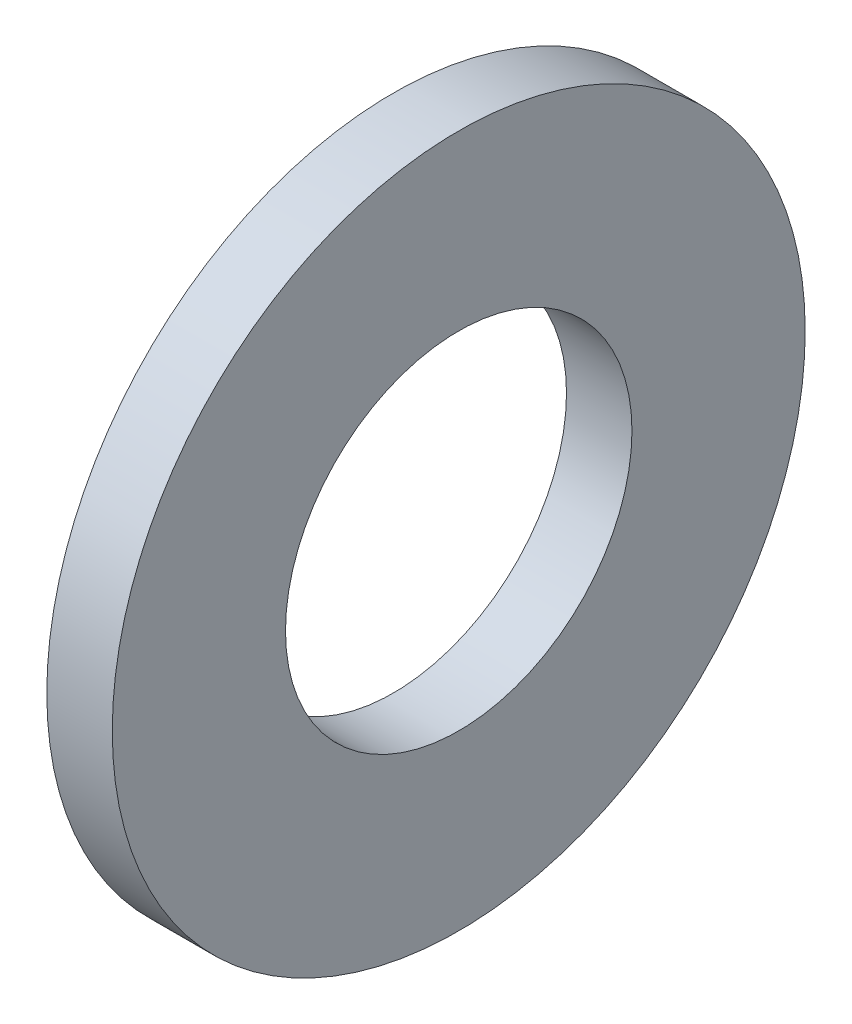
ISO-10303-21;
HEADER;
FILE_DESCRIPTION(('STEP AP214'),'2;1');
FILE_NAME('part.step','',(''),(''),'','','');
FILE_SCHEMA(('AUTOMOTIVE_DESIGN { 1 0 10303 214 1 1 1 1 }'));
ENDSEC;
DATA;
#1=APPLICATION_CONTEXT('core data for automotive mechanical design processes');
#2=APPLICATION_PROTOCOL_DEFINITION('international standard','automotive_design',2000,#1);
#3=PRODUCT_CONTEXT('',#1,'mechanical');
#4=PRODUCT('Part','Part','',(#3));
#5=PRODUCT_RELATED_PRODUCT_CATEGORY('part','',(#4));
#6=PRODUCT_DEFINITION_FORMATION('','',#4);
#7=PRODUCT_DEFINITION_CONTEXT('part definition',#1,'design');
#8=PRODUCT_DEFINITION('design','',#6,#7);
#9=PRODUCT_DEFINITION_SHAPE('','',#8);
#10=(LENGTH_UNIT() NAMED_UNIT(*) SI_UNIT(.MILLI.,.METRE.));
#11=(NAMED_UNIT(*) PLANE_ANGLE_UNIT() SI_UNIT($,.RADIAN.));
#12=(NAMED_UNIT(*) SI_UNIT($,.STERADIAN.) SOLID_ANGLE_UNIT());
#13=UNCERTAINTY_MEASURE_WITH_UNIT(LENGTH_MEASURE(1.E-05),#10,'distance_accuracy_value','');
#14=(GEOMETRIC_REPRESENTATION_CONTEXT(3) GLOBAL_UNCERTAINTY_ASSIGNED_CONTEXT((#13)) GLOBAL_UNIT_ASSIGNED_CONTEXT((#10,
#11,#12)) REPRESENTATION_CONTEXT('',''));
#15=CARTESIAN_POINT('',(0.,0.,0.));
#16=DIRECTION('',(0.,0.,1.));
#17=DIRECTION('',(1.,0.,0.));
#18=AXIS2_PLACEMENT_3D('',#15,#16,#17);
#19=CARTESIAN_POINT('',(-34.9249999999999,1.11022302462516E-13,0.));
#20=DIRECTION('',(-1.,0.,0.));
#21=DIRECTION('',(0.,0.,1.));
#22=AXIS2_PLACEMENT_3D('',#19,#20,#21);
#23=CYLINDRICAL_SURFACE('',#22,4.3688);
#24=CARTESIAN_POINT('',(0.,0.,0.));
#25=DIRECTION('',(-1.,0.,0.));
#26=DIRECTION('',(0.,0.,1.));
#27=AXIS2_PLACEMENT_3D('',#24,#25,#26);
#28=CIRCLE('',#27,4.3688);
#29=CARTESIAN_POINT('',(0.,0.,4.3688));
#30=VERTEX_POINT('',#29);
#31=EDGE_CURVE('E12',#30,#30,#28,.T.);
#32=ORIENTED_EDGE('',*,*,#31,.F.);
#33=EDGE_LOOP('',(#32));
#34=FACE_BOUND('',#33,.T.);
#35=CARTESIAN_POINT('',(-1.65100000000001,0.,0.));
#36=DIRECTION('',(-1.,0.,0.));
#37=DIRECTION('',(0.,0.,1.));
#38=AXIS2_PLACEMENT_3D('',#35,#36,#37);
#39=CIRCLE('',#38,4.3688);
#40=CARTESIAN_POINT('',(-1.65100000000001,0.,4.36879999999994));
#41=VERTEX_POINT('',#40);
#42=EDGE_CURVE('E55',#41,#41,#39,.T.);
#43=ORIENTED_EDGE('',*,*,#42,.T.);
#44=EDGE_LOOP('',(#43));
#45=FACE_BOUND('',#44,.T.);
#46=ADVANCED_FACE('F41',(#34,#45),#23,.F.);
#47=CARTESIAN_POINT('',(0.,4.36880000000017,0.));
#48=DIRECTION('',(-1.,0.,0.));
#49=DIRECTION('',(0.,0.,1.));
#50=AXIS2_PLACEMENT_3D('',#47,#48,#49);
#51=PLANE('',#50);
#52=CARTESIAN_POINT('',(0.,0.,0.));
#53=DIRECTION('',(-1.,0.,0.));
#54=DIRECTION('',(0.,0.,1.));
#55=AXIS2_PLACEMENT_3D('',#52,#53,#54);
#56=CIRCLE('',#55,8.7376);
#57=CARTESIAN_POINT('',(0.,0.,8.7376));
#58=VERTEX_POINT('',#57);
#59=EDGE_CURVE('E47',#58,#58,#56,.T.);
#60=ORIENTED_EDGE('',*,*,#59,.F.);
#61=EDGE_LOOP('',(#60));
#62=FACE_BOUND('',#61,.T.);
#63=ORIENTED_EDGE('',*,*,#31,.T.);
#64=EDGE_LOOP('',(#63));
#65=FACE_BOUND('',#64,.T.);
#66=ADVANCED_FACE('F70',(#62,#65),#51,.F.);
#67=CARTESIAN_POINT('',(-34.9249999999999,1.11022302462516E-13,0.));
#68=DIRECTION('',(-1.,0.,0.));
#69=DIRECTION('',(0.,0.,1.));
#70=AXIS2_PLACEMENT_3D('',#67,#68,#69);
#71=CYLINDRICAL_SURFACE('',#70,8.7376);
#72=CARTESIAN_POINT('',(-1.65100000000001,0.,0.));
#73=DIRECTION('',(-1.,0.,0.));
#74=DIRECTION('',(0.,0.,1.));
#75=AXIS2_PLACEMENT_3D('',#72,#73,#74);
#76=CIRCLE('',#75,8.7376);
#77=CARTESIAN_POINT('',(-1.65100000000001,0.,8.73759999999994));
#78=VERTEX_POINT('',#77);
#79=EDGE_CURVE('E51',#78,#78,#76,.T.);
#80=ORIENTED_EDGE('',*,*,#79,.F.);
#81=EDGE_LOOP('',(#80));
#82=FACE_BOUND('',#81,.T.);
#83=ORIENTED_EDGE('',*,*,#59,.T.);
#84=EDGE_LOOP('',(#83));
#85=FACE_BOUND('',#84,.T.);
#86=ADVANCED_FACE('F65',(#82,#85),#71,.T.);
#87=CARTESIAN_POINT('',(-1.65099999999996,8.73760000000018,0.));
#88=DIRECTION('',(1.,0.,0.));
#89=DIRECTION('',(0.,0.,-1.));
#90=AXIS2_PLACEMENT_3D('',#87,#88,#89);
#91=PLANE('',#90);
#92=ORIENTED_EDGE('',*,*,#42,.F.);
#93=EDGE_LOOP('',(#92));
#94=FACE_BOUND('',#93,.T.);
#95=ORIENTED_EDGE('',*,*,#79,.T.);
#96=EDGE_LOOP('',(#95));
#97=FACE_BOUND('',#96,.T.);
#98=ADVANCED_FACE('F62',(#94,#97),#91,.F.);
#99=CLOSED_SHELL('',(#46,#66,#86,#98));
#100=MANIFOLD_SOLID_BREP('B2',#99);
#101=ADVANCED_BREP_SHAPE_REPRESENTATION('',(#18,#100),#14);
#102=SHAPE_DEFINITION_REPRESENTATION(#9,#101);
ENDSEC;
END-ISO-10303-21;
